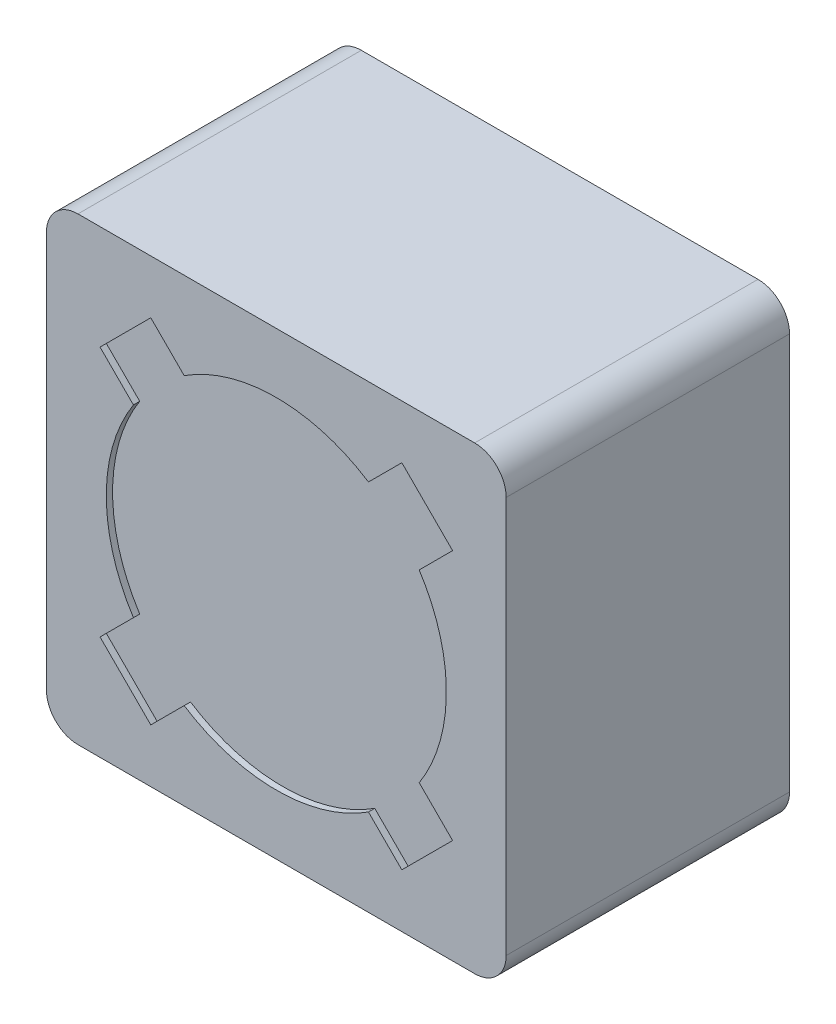
ISO-10303-21;
HEADER;
FILE_DESCRIPTION(('STEP AP214'),'2;1');
FILE_NAME('part.step','',(''),(''),'','','');
FILE_SCHEMA(('AUTOMOTIVE_DESIGN { 1 0 10303 214 1 1 1 1 }'));
ENDSEC;
DATA;
#1=APPLICATION_CONTEXT('core data for automotive mechanical design processes');
#2=APPLICATION_PROTOCOL_DEFINITION('international standard','automotive_design',2000,#1);
#3=PRODUCT_CONTEXT('',#1,'mechanical');
#4=PRODUCT('Part','Part','',(#3));
#5=PRODUCT_RELATED_PRODUCT_CATEGORY('part','',(#4));
#6=PRODUCT_DEFINITION_FORMATION('','',#4);
#7=PRODUCT_DEFINITION_CONTEXT('part definition',#1,'design');
#8=PRODUCT_DEFINITION('design','',#6,#7);
#9=PRODUCT_DEFINITION_SHAPE('','',#8);
#10=(LENGTH_UNIT() NAMED_UNIT(*) SI_UNIT(.MILLI.,.METRE.));
#11=(NAMED_UNIT(*) PLANE_ANGLE_UNIT() SI_UNIT($,.RADIAN.));
#12=(NAMED_UNIT(*) SI_UNIT($,.STERADIAN.) SOLID_ANGLE_UNIT());
#13=UNCERTAINTY_MEASURE_WITH_UNIT(LENGTH_MEASURE(1.E-05),#10,'distance_accuracy_value','');
#14=(GEOMETRIC_REPRESENTATION_CONTEXT(3) GLOBAL_UNCERTAINTY_ASSIGNED_CONTEXT((#13)) GLOBAL_UNIT_ASSIGNED_CONTEXT((#10,
#11,#12)) REPRESENTATION_CONTEXT('',''));
#15=CARTESIAN_POINT('',(0.,0.,0.));
#16=DIRECTION('',(0.,0.,1.));
#17=DIRECTION('',(1.,0.,0.));
#18=AXIS2_PLACEMENT_3D('',#15,#16,#17);
#19=CARTESIAN_POINT('',(0.,0.,4.4));
#20=DIRECTION('',(0.,0.,1.));
#21=DIRECTION('',(1.,0.,0.));
#22=AXIS2_PLACEMENT_3D('',#19,#20,#21);
#23=CYLINDRICAL_SURFACE('',#22,2.7);
#24=CARTESIAN_POINT('',(0.,0.,4.5));
#25=DIRECTION('',(0.,0.,1.));
#26=DIRECTION('',(1.,0.,0.));
#27=AXIS2_PLACEMENT_3D('',#24,#25,#26);
#28=CIRCLE('',#27,2.7);
#29=CARTESIAN_POINT('',(-2.26921002247596,1.46310829192328,4.5));
#30=VERTEX_POINT('',#29);
#31=CARTESIAN_POINT('',(-2.26921002247594,-1.4631082919233,4.5));
#32=VERTEX_POINT('',#31);
#33=EDGE_CURVE('E311',#30,#32,#28,.T.);
#34=ORIENTED_EDGE('',*,*,#33,.T.);
#35=DIRECTION('',(0.,0.,1.));
#36=VECTOR('',#35,1.);
#37=CARTESIAN_POINT('',(-2.26921002247594,-1.4631082919233,4.4));
#38=LINE('',#37,#36);
#39=CARTESIAN_POINT('',(-2.26921002247594,-1.4631082919233,4.4));
#40=VERTEX_POINT('',#39);
#41=EDGE_CURVE('E232',#40,#32,#38,.T.);
#42=ORIENTED_EDGE('',*,*,#41,.F.);
#43=CARTESIAN_POINT('',(0.,0.,4.4));
#44=DIRECTION('',(0.,0.,1.));
#45=DIRECTION('',(1.,0.,0.));
#46=AXIS2_PLACEMENT_3D('',#43,#44,#45);
#47=CIRCLE('',#46,2.7);
#48=CARTESIAN_POINT('',(-2.26921002247596,1.46310829192328,4.4));
#49=VERTEX_POINT('',#48);
#50=EDGE_CURVE('E306',#49,#40,#47,.T.);
#51=ORIENTED_EDGE('',*,*,#50,.F.);
#52=DIRECTION('',(0.,0.,1.));
#53=VECTOR('',#52,1.);
#54=CARTESIAN_POINT('',(-2.26921002247596,1.46310829192328,4.4));
#55=LINE('',#54,#53);
#56=EDGE_CURVE('E302',#49,#30,#55,.T.);
#57=ORIENTED_EDGE('',*,*,#56,.T.);
#58=EDGE_LOOP('',(#34,#42,#51,#57));
#59=FACE_BOUND('',#58,.T.);
#60=ADVANCED_FACE('F35',(#59),#23,.F.);
#61=CARTESIAN_POINT('',(-1.46310829192328,-2.26921002247596,4.4));
#62=VERTEX_POINT('',#61);
#63=CARTESIAN_POINT('',(1.46310829192329,-2.26921002247595,4.4));
#64=VERTEX_POINT('',#63);
#65=EDGE_CURVE('E309',#62,#64,#47,.T.);
#66=ORIENTED_EDGE('',*,*,#65,.F.);
#67=DIRECTION('',(0.,0.,1.));
#68=VECTOR('',#67,1.);
#69=CARTESIAN_POINT('',(-1.46310829192328,-2.26921002247596,4.4));
#70=LINE('',#69,#68);
#71=CARTESIAN_POINT('',(-1.46310829192328,-2.26921002247596,4.5));
#72=VERTEX_POINT('',#71);
#73=EDGE_CURVE('E207',#62,#72,#70,.T.);
#74=ORIENTED_EDGE('',*,*,#73,.T.);
#75=CARTESIAN_POINT('',(1.46310829192329,-2.26921002247595,4.5));
#76=VERTEX_POINT('',#75);
#77=EDGE_CURVE('E314',#72,#76,#28,.T.);
#78=ORIENTED_EDGE('',*,*,#77,.T.);
#79=DIRECTION('',(0.,0.,1.));
#80=VECTOR('',#79,1.);
#81=CARTESIAN_POINT('',(1.46310829192329,-2.26921002247595,4.4));
#82=LINE('',#81,#80);
#83=EDGE_CURVE('E252',#64,#76,#82,.T.);
#84=ORIENTED_EDGE('',*,*,#83,.F.);
#85=EDGE_LOOP('',(#66,#74,#78,#84));
#86=FACE_BOUND('',#85,.T.);
#87=ADVANCED_FACE('F418',(#86),#23,.F.);
#88=CARTESIAN_POINT('',(2.26921002247596,-1.46310829192328,4.4));
#89=VERTEX_POINT('',#88);
#90=CARTESIAN_POINT('',(2.26921002247594,1.46310829192332,4.4));
#91=VERTEX_POINT('',#90);
#92=EDGE_CURVE('E624',#89,#91,#47,.T.);
#93=ORIENTED_EDGE('',*,*,#92,.F.);
#94=DIRECTION('',(0.,0.,1.));
#95=VECTOR('',#94,1.);
#96=CARTESIAN_POINT('',(2.26921002247596,-1.46310829192328,4.4));
#97=LINE('',#96,#95);
#98=CARTESIAN_POINT('',(2.26921002247596,-1.46310829192328,4.5));
#99=VERTEX_POINT('',#98);
#100=EDGE_CURVE('E254',#89,#99,#97,.T.);
#101=ORIENTED_EDGE('',*,*,#100,.T.);
#102=CARTESIAN_POINT('',(2.26921002247594,1.46310829192332,4.5));
#103=VERTEX_POINT('',#102);
#104=EDGE_CURVE('E633',#99,#103,#28,.T.);
#105=ORIENTED_EDGE('',*,*,#104,.T.);
#106=DIRECTION('',(0.,0.,1.));
#107=VECTOR('',#106,1.);
#108=CARTESIAN_POINT('',(2.26921002247594,1.46310829192332,4.4));
#109=LINE('',#108,#107);
#110=EDGE_CURVE('E274',#91,#103,#109,.T.);
#111=ORIENTED_EDGE('',*,*,#110,.F.);
#112=EDGE_LOOP('',(#93,#101,#105,#111));
#113=FACE_BOUND('',#112,.T.);
#114=ADVANCED_FACE('F416',(#113),#23,.F.);
#115=CARTESIAN_POINT('',(3.65,-3.65,4.5));
#116=DIRECTION('',(-1.,0.,0.));
#117=DIRECTION('',(0.,0.,1.));
#118=AXIS2_PLACEMENT_3D('',#115,#116,#117);
#119=PLANE('',#118);
#120=DIRECTION('',(0.,1.,0.));
#121=VECTOR('',#120,1.);
#122=CARTESIAN_POINT('',(3.65,-3.65,4.5));
#123=LINE('',#122,#121);
#124=CARTESIAN_POINT('',(3.65,-3.15,4.5));
#125=VERTEX_POINT('',#124);
#126=CARTESIAN_POINT('',(3.65,3.15,4.5));
#127=VERTEX_POINT('',#126);
#128=EDGE_CURVE('E315',#125,#127,#123,.T.);
#129=ORIENTED_EDGE('',*,*,#128,.F.);
#130=DIRECTION('',(0.,0.,-1.));
#131=VECTOR('',#130,1.);
#132=CARTESIAN_POINT('',(3.65,-3.15,4.5));
#133=LINE('',#132,#131);
#134=CARTESIAN_POINT('',(3.65,-3.15,0.));
#135=VERTEX_POINT('',#134);
#136=EDGE_CURVE('E366',#125,#135,#133,.T.);
#137=ORIENTED_EDGE('',*,*,#136,.T.);
#138=DIRECTION('',(0.,1.,0.));
#139=VECTOR('',#138,1.);
#140=CARTESIAN_POINT('',(3.65,-3.65,0.));
#141=LINE('',#140,#139);
#142=CARTESIAN_POINT('',(3.65,3.15,0.));
#143=VERTEX_POINT('',#142);
#144=EDGE_CURVE('E308',#135,#143,#141,.T.);
#145=ORIENTED_EDGE('',*,*,#144,.T.);
#146=DIRECTION('',(0.,0.,-1.));
#147=VECTOR('',#146,1.);
#148=CARTESIAN_POINT('',(3.65,3.15,4.5));
#149=LINE('',#148,#147);
#150=EDGE_CURVE('E364',#143,#127,#149,.F.);
#151=ORIENTED_EDGE('',*,*,#150,.T.);
#152=EDGE_LOOP('',(#129,#137,#145,#151));
#153=FACE_BOUND('',#152,.T.);
#154=ADVANCED_FACE('F406',(#153),#119,.F.);
#155=CARTESIAN_POINT('',(-3.65,3.65,4.5));
#156=DIRECTION('',(0.,-1.,0.));
#157=DIRECTION('',(0.,0.,-1.));
#158=AXIS2_PLACEMENT_3D('',#155,#156,#157);
#159=PLANE('',#158);
#160=DIRECTION('',(-1.,0.,0.));
#161=VECTOR('',#160,1.);
#162=CARTESIAN_POINT('',(-3.65,3.65,0.));
#163=LINE('',#162,#161);
#164=CARTESIAN_POINT('',(3.15,3.65,0.));
#165=VERTEX_POINT('',#164);
#166=CARTESIAN_POINT('',(-3.15,3.65,0.));
#167=VERTEX_POINT('',#166);
#168=EDGE_CURVE('E331',#165,#167,#163,.T.);
#169=ORIENTED_EDGE('',*,*,#168,.T.);
#170=DIRECTION('',(0.,0.,-1.));
#171=VECTOR('',#170,1.);
#172=CARTESIAN_POINT('',(-3.15,3.65,4.5));
#173=LINE('',#172,#171);
#174=CARTESIAN_POINT('',(-3.15,3.65,4.5));
#175=VERTEX_POINT('',#174);
#176=EDGE_CURVE('E11',#167,#175,#173,.F.);
#177=ORIENTED_EDGE('',*,*,#176,.T.);
#178=DIRECTION('',(-1.,0.,0.));
#179=VECTOR('',#178,1.);
#180=CARTESIAN_POINT('',(-3.65,3.65,4.5));
#181=LINE('',#180,#179);
#182=CARTESIAN_POINT('',(3.15,3.65,4.5));
#183=VERTEX_POINT('',#182);
#184=EDGE_CURVE('E318',#183,#175,#181,.T.);
#185=ORIENTED_EDGE('',*,*,#184,.F.);
#186=DIRECTION('',(0.,0.,-1.));
#187=VECTOR('',#186,1.);
#188=CARTESIAN_POINT('',(3.15,3.65,4.5));
#189=LINE('',#188,#187);
#190=EDGE_CURVE('E43',#183,#165,#189,.T.);
#191=ORIENTED_EDGE('',*,*,#190,.T.);
#192=EDGE_LOOP('',(#169,#177,#185,#191));
#193=FACE_BOUND('',#192,.T.);
#194=ADVANCED_FACE('F373',(#193),#159,.F.);
#195=CARTESIAN_POINT('',(-3.65,-3.65,4.5));
#196=DIRECTION('',(1.,0.,0.));
#197=DIRECTION('',(0.,0.,-1.));
#198=AXIS2_PLACEMENT_3D('',#195,#196,#197);
#199=PLANE('',#198);
#200=DIRECTION('',(0.,-1.,0.));
#201=VECTOR('',#200,1.);
#202=CARTESIAN_POINT('',(-3.65,-3.65,0.));
#203=LINE('',#202,#201);
#204=CARTESIAN_POINT('',(-3.65,3.15,0.));
#205=VERTEX_POINT('',#204);
#206=CARTESIAN_POINT('',(-3.65,-3.15,0.));
#207=VERTEX_POINT('',#206);
#208=EDGE_CURVE('E334',#205,#207,#203,.T.);
#209=ORIENTED_EDGE('',*,*,#208,.T.);
#210=DIRECTION('',(0.,0.,-1.));
#211=VECTOR('',#210,1.);
#212=CARTESIAN_POINT('',(-3.65,-3.15,4.5));
#213=LINE('',#212,#211);
#214=CARTESIAN_POINT('',(-3.65,-3.15,4.5));
#215=VERTEX_POINT('',#214);
#216=EDGE_CURVE('E354',#207,#215,#213,.F.);
#217=ORIENTED_EDGE('',*,*,#216,.T.);
#218=DIRECTION('',(0.,-1.,0.));
#219=VECTOR('',#218,1.);
#220=CARTESIAN_POINT('',(-3.65,-3.65,4.5));
#221=LINE('',#220,#219);
#222=CARTESIAN_POINT('',(-3.65,3.15,4.5));
#223=VERTEX_POINT('',#222);
#224=EDGE_CURVE('E322',#223,#215,#221,.T.);
#225=ORIENTED_EDGE('',*,*,#224,.F.);
#226=DIRECTION('',(0.,0.,-1.));
#227=VECTOR('',#226,1.);
#228=CARTESIAN_POINT('',(-3.65,3.15,4.5));
#229=LINE('',#228,#227);
#230=EDGE_CURVE('E351',#223,#205,#229,.T.);
#231=ORIENTED_EDGE('',*,*,#230,.T.);
#232=EDGE_LOOP('',(#209,#217,#225,#231));
#233=FACE_BOUND('',#232,.T.);
#234=ADVANCED_FACE('F388',(#233),#199,.F.);
#235=CARTESIAN_POINT('',(-3.65,-3.65,4.5));
#236=DIRECTION('',(0.,1.,0.));
#237=DIRECTION('',(0.,0.,1.));
#238=AXIS2_PLACEMENT_3D('',#235,#236,#237);
#239=PLANE('',#238);
#240=DIRECTION('',(1.,0.,0.));
#241=VECTOR('',#240,1.);
#242=CARTESIAN_POINT('',(-3.65,-3.65,4.5));
#243=LINE('',#242,#241);
#244=CARTESIAN_POINT('',(-3.15,-3.65,4.5));
#245=VERTEX_POINT('',#244);
#246=CARTESIAN_POINT('',(3.15,-3.65,4.5));
#247=VERTEX_POINT('',#246);
#248=EDGE_CURVE('E325',#245,#247,#243,.T.);
#249=ORIENTED_EDGE('',*,*,#248,.F.);
#250=DIRECTION('',(0.,0.,-1.));
#251=VECTOR('',#250,1.);
#252=CARTESIAN_POINT('',(-3.15,-3.65,4.5));
#253=LINE('',#252,#251);
#254=CARTESIAN_POINT('',(-3.15,-3.65,0.));
#255=VERTEX_POINT('',#254);
#256=EDGE_CURVE('E340',#245,#255,#253,.T.);
#257=ORIENTED_EDGE('',*,*,#256,.T.);
#258=DIRECTION('',(1.,0.,0.));
#259=VECTOR('',#258,1.);
#260=CARTESIAN_POINT('',(-3.65,-3.65,0.));
#261=LINE('',#260,#259);
#262=CARTESIAN_POINT('',(3.15,-3.65,0.));
#263=VERTEX_POINT('',#262);
#264=EDGE_CURVE('E319',#255,#263,#261,.T.);
#265=ORIENTED_EDGE('',*,*,#264,.T.);
#266=DIRECTION('',(0.,0.,-1.));
#267=VECTOR('',#266,1.);
#268=CARTESIAN_POINT('',(3.15,-3.65,4.5));
#269=LINE('',#268,#267);
#270=EDGE_CURVE('E328',#263,#247,#269,.F.);
#271=ORIENTED_EDGE('',*,*,#270,.T.);
#272=EDGE_LOOP('',(#249,#257,#265,#271));
#273=FACE_BOUND('',#272,.T.);
#274=ADVANCED_FACE('F398',(#273),#239,.F.);
#275=CARTESIAN_POINT('',(0.,0.,4.5));
#276=DIRECTION('',(0.,0.,-1.));
#277=DIRECTION('',(-1.,0.,0.));
#278=AXIS2_PLACEMENT_3D('',#275,#276,#277);
#279=PLANE('',#278);
#280=DIRECTION('',(0.707106781186551,-0.707106781186544,0.));
#281=VECTOR('',#280,1.);
#282=CARTESIAN_POINT('',(-1.99343837781318,-2.79954010836588,4.5));
#283=LINE('',#282,#281);
#284=CARTESIAN_POINT('',(-2.79954010836585,-1.99343837781322,4.5));
#285=VERTEX_POINT('',#284);
#286=CARTESIAN_POINT('',(-1.99343837781318,-2.79954010836588,4.5));
#287=VERTEX_POINT('',#286);
#288=EDGE_CURVE('E204',#285,#287,#283,.T.);
#289=ORIENTED_EDGE('',*,*,#288,.F.);
#290=DIRECTION('',(-0.707106781186543,-0.707106781186552,0.));
#291=VECTOR('',#290,1.);
#292=CARTESIAN_POINT('',(-2.79954010836585,-1.99343837781322,4.5));
#293=LINE('',#292,#291);
#294=EDGE_CURVE('E219',#32,#285,#293,.T.);
#295=ORIENTED_EDGE('',*,*,#294,.F.);
#296=ORIENTED_EDGE('',*,*,#33,.F.);
#297=DIRECTION('',(0.707106781186549,-0.707106781186546,0.));
#298=VECTOR('',#297,1.);
#299=CARTESIAN_POINT('',(-2.79954010836587,1.99343837781319,4.5));
#300=LINE('',#299,#298);
#301=CARTESIAN_POINT('',(-2.79954010836587,1.99343837781319,4.5));
#302=VERTEX_POINT('',#301);
#303=EDGE_CURVE('E292',#302,#30,#300,.T.);
#304=ORIENTED_EDGE('',*,*,#303,.F.);
#305=DIRECTION('',(-0.707106781186546,-0.707106781186549,0.));
#306=VECTOR('',#305,1.);
#307=CARTESIAN_POINT('',(-2.79954010836587,1.99343837781319,4.5));
#308=LINE('',#307,#306);
#309=CARTESIAN_POINT('',(-1.99343837781321,2.79954010836586,4.5));
#310=VERTEX_POINT('',#309);
#311=EDGE_CURVE('E231',#310,#302,#308,.T.);
#312=ORIENTED_EDGE('',*,*,#311,.F.);
#313=DIRECTION('',(-0.707106781186549,0.707106781186546,0.));
#314=VECTOR('',#313,1.);
#315=CARTESIAN_POINT('',(-1.99343837781321,2.79954010836586,4.5));
#316=LINE('',#315,#314);
#317=CARTESIAN_POINT('',(-1.46310829192329,2.26921002247595,4.5));
#318=VERTEX_POINT('',#317);
#319=EDGE_CURVE('E284',#318,#310,#316,.T.);
#320=ORIENTED_EDGE('',*,*,#319,.F.);
#321=CARTESIAN_POINT('',(1.46310829192326,2.26921002247597,4.5));
#322=VERTEX_POINT('',#321);
#323=EDGE_CURVE('E298',#322,#318,#28,.T.);
#324=ORIENTED_EDGE('',*,*,#323,.F.);
#325=DIRECTION('',(-0.707106781186539,-0.707106781186556,0.));
#326=VECTOR('',#325,1.);
#327=CARTESIAN_POINT('',(1.99343837781316,2.79954010836589,4.5));
#328=LINE('',#327,#326);
#329=CARTESIAN_POINT('',(1.99343837781316,2.79954010836589,4.5));
#330=VERTEX_POINT('',#329);
#331=EDGE_CURVE('E269',#330,#322,#328,.T.);
#332=ORIENTED_EDGE('',*,*,#331,.F.);
#333=DIRECTION('',(-0.707106781186556,0.707106781186539,0.));
#334=VECTOR('',#333,1.);
#335=CARTESIAN_POINT('',(1.99343837781316,2.79954010836589,4.5));
#336=LINE('',#335,#334);
#337=CARTESIAN_POINT('',(2.79954010836584,1.99343837781324,4.5));
#338=VERTEX_POINT('',#337);
#339=EDGE_CURVE('E266',#338,#330,#336,.T.);
#340=ORIENTED_EDGE('',*,*,#339,.F.);
#341=DIRECTION('',(0.707106781186538,0.707106781186557,0.));
#342=VECTOR('',#341,1.);
#343=CARTESIAN_POINT('',(2.79954010836584,1.99343837781324,4.5));
#344=LINE('',#343,#342);
#345=EDGE_CURVE('E260',#103,#338,#344,.T.);
#346=ORIENTED_EDGE('',*,*,#345,.F.);
#347=ORIENTED_EDGE('',*,*,#104,.F.);
#348=DIRECTION('',(-0.707106781186549,0.707106781186546,0.));
#349=VECTOR('',#348,1.);
#350=CARTESIAN_POINT('',(2.79954010836587,-1.99343837781319,4.5));
#351=LINE('',#350,#349);
#352=CARTESIAN_POINT('',(2.79954010836587,-1.99343837781319,4.5));
#353=VERTEX_POINT('',#352);
#354=EDGE_CURVE('E246',#353,#99,#351,.T.);
#355=ORIENTED_EDGE('',*,*,#354,.F.);
#356=DIRECTION('',(0.707106781186546,0.707106781186549,0.));
#357=VECTOR('',#356,1.);
#358=CARTESIAN_POINT('',(2.79954010836587,-1.99343837781319,4.5));
#359=LINE('',#358,#357);
#360=CARTESIAN_POINT('',(1.99343837781321,-2.79954010836586,4.5));
#361=VERTEX_POINT('',#360);
#362=EDGE_CURVE('E243',#361,#353,#359,.T.);
#363=ORIENTED_EDGE('',*,*,#362,.F.);
#364=DIRECTION('',(0.707106781186549,-0.707106781186546,0.));
#365=VECTOR('',#364,1.);
#366=CARTESIAN_POINT('',(1.99343837781321,-2.79954010836586,4.5));
#367=LINE('',#366,#365);
#368=EDGE_CURVE('E237',#76,#361,#367,.T.);
#369=ORIENTED_EDGE('',*,*,#368,.F.);
#370=ORIENTED_EDGE('',*,*,#77,.F.);
#371=DIRECTION('',(0.707106781186544,0.707106781186551,0.));
#372=VECTOR('',#371,1.);
#373=CARTESIAN_POINT('',(-1.99343837781318,-2.79954010836588,4.5));
#374=LINE('',#373,#372);
#375=EDGE_CURVE('E222',#287,#72,#374,.T.);
#376=ORIENTED_EDGE('',*,*,#375,.F.);
#377=EDGE_LOOP('',(#289,#295,#296,#304,#312,#320,#324,#332,#340,#346,#347,#355,#363,#369,#370,#376));
#378=FACE_BOUND('',#377,.T.);
#379=ORIENTED_EDGE('',*,*,#224,.T.);
#380=CARTESIAN_POINT('',(-3.15,-3.15,4.5));
#381=DIRECTION('',(0.,0.,-1.));
#382=DIRECTION('',(-1.,0.,0.));
#383=AXIS2_PLACEMENT_3D('',#380,#381,#382);
#384=CIRCLE('',#383,0.5);
#385=EDGE_CURVE('E362',#215,#245,#384,.F.);
#386=ORIENTED_EDGE('',*,*,#385,.T.);
#387=ORIENTED_EDGE('',*,*,#248,.T.);
#388=CARTESIAN_POINT('',(3.15,-3.15,4.5));
#389=DIRECTION('',(0.,0.,-1.));
#390=DIRECTION('',(-1.,0.,0.));
#391=AXIS2_PLACEMENT_3D('',#388,#389,#390);
#392=CIRCLE('',#391,0.5);
#393=EDGE_CURVE('E360',#247,#125,#392,.F.);
#394=ORIENTED_EDGE('',*,*,#393,.T.);
#395=ORIENTED_EDGE('',*,*,#128,.T.);
#396=CARTESIAN_POINT('',(3.15,3.15,4.5));
#397=DIRECTION('',(0.,0.,-1.));
#398=DIRECTION('',(-1.,0.,0.));
#399=AXIS2_PLACEMENT_3D('',#396,#397,#398);
#400=CIRCLE('',#399,0.5);
#401=EDGE_CURVE('E356',#127,#183,#400,.F.);
#402=ORIENTED_EDGE('',*,*,#401,.T.);
#403=ORIENTED_EDGE('',*,*,#184,.T.);
#404=CARTESIAN_POINT('',(-3.15,3.15,4.5));
#405=DIRECTION('',(0.,0.,-1.));
#406=DIRECTION('',(-1.,0.,0.));
#407=AXIS2_PLACEMENT_3D('',#404,#405,#406);
#408=CIRCLE('',#407,0.5);
#409=EDGE_CURVE('E358',#175,#223,#408,.F.);
#410=ORIENTED_EDGE('',*,*,#409,.T.);
#411=EDGE_LOOP('',(#379,#386,#387,#394,#395,#402,#403,#410));
#412=FACE_BOUND('',#411,.T.);
#413=ADVANCED_FACE('F392',(#378,#412),#279,.F.);
#414=CARTESIAN_POINT('',(0.,0.,0.));
#415=DIRECTION('',(0.,0.,-1.));
#416=DIRECTION('',(-1.,0.,0.));
#417=AXIS2_PLACEMENT_3D('',#414,#415,#416);
#418=PLANE('',#417);
#419=ORIENTED_EDGE('',*,*,#264,.F.);
#420=CARTESIAN_POINT('',(-3.15,-3.15,0.));
#421=DIRECTION('',(0.,0.,-1.));
#422=DIRECTION('',(-1.,0.,0.));
#423=AXIS2_PLACEMENT_3D('',#420,#421,#422);
#424=CIRCLE('',#423,0.5);
#425=EDGE_CURVE('E349',#255,#207,#424,.T.);
#426=ORIENTED_EDGE('',*,*,#425,.T.);
#427=ORIENTED_EDGE('',*,*,#208,.F.);
#428=CARTESIAN_POINT('',(-3.15,3.15,0.));
#429=DIRECTION('',(0.,0.,-1.));
#430=DIRECTION('',(-1.,0.,0.));
#431=AXIS2_PLACEMENT_3D('',#428,#429,#430);
#432=CIRCLE('',#431,0.5);
#433=EDGE_CURVE('E345',#205,#167,#432,.T.);
#434=ORIENTED_EDGE('',*,*,#433,.T.);
#435=ORIENTED_EDGE('',*,*,#168,.F.);
#436=CARTESIAN_POINT('',(3.15,3.15,0.));
#437=DIRECTION('',(0.,0.,-1.));
#438=DIRECTION('',(-1.,0.,0.));
#439=AXIS2_PLACEMENT_3D('',#436,#437,#438);
#440=CIRCLE('',#439,0.5);
#441=EDGE_CURVE('E343',#165,#143,#440,.T.);
#442=ORIENTED_EDGE('',*,*,#441,.T.);
#443=ORIENTED_EDGE('',*,*,#144,.F.);
#444=CARTESIAN_POINT('',(3.15,-3.15,0.));
#445=DIRECTION('',(0.,0.,-1.));
#446=DIRECTION('',(-1.,0.,0.));
#447=AXIS2_PLACEMENT_3D('',#444,#445,#446);
#448=CIRCLE('',#447,0.5);
#449=EDGE_CURVE('E347',#135,#263,#448,.T.);
#450=ORIENTED_EDGE('',*,*,#449,.T.);
#451=EDGE_LOOP('',(#419,#426,#427,#434,#435,#442,#443,#450));
#452=FACE_BOUND('',#451,.T.);
#453=ADVANCED_FACE('F379',(#452),#418,.T.);
#454=CARTESIAN_POINT('',(-3.15,-3.15,4.5));
#455=DIRECTION('',(0.,0.,-1.));
#456=DIRECTION('',(-1.,0.,0.));
#457=AXIS2_PLACEMENT_3D('',#454,#455,#456);
#458=CYLINDRICAL_SURFACE('',#457,0.5);
#459=ORIENTED_EDGE('',*,*,#385,.F.);
#460=ORIENTED_EDGE('',*,*,#216,.F.);
#461=ORIENTED_EDGE('',*,*,#425,.F.);
#462=ORIENTED_EDGE('',*,*,#256,.F.);
#463=EDGE_LOOP('',(#459,#460,#461,#462));
#464=FACE_BOUND('',#463,.T.);
#465=ADVANCED_FACE('F396',(#464),#458,.T.);
#466=CARTESIAN_POINT('',(3.15,-3.15,4.5));
#467=DIRECTION('',(0.,0.,-1.));
#468=DIRECTION('',(-1.,0.,0.));
#469=AXIS2_PLACEMENT_3D('',#466,#467,#468);
#470=CYLINDRICAL_SURFACE('',#469,0.5);
#471=ORIENTED_EDGE('',*,*,#393,.F.);
#472=ORIENTED_EDGE('',*,*,#270,.F.);
#473=ORIENTED_EDGE('',*,*,#449,.F.);
#474=ORIENTED_EDGE('',*,*,#136,.F.);
#475=EDGE_LOOP('',(#471,#472,#473,#474));
#476=FACE_BOUND('',#475,.T.);
#477=ADVANCED_FACE('F403',(#476),#470,.T.);
#478=CARTESIAN_POINT('',(-3.15,3.15,4.5));
#479=DIRECTION('',(0.,0.,-1.));
#480=DIRECTION('',(-1.,0.,0.));
#481=AXIS2_PLACEMENT_3D('',#478,#479,#480);
#482=CYLINDRICAL_SURFACE('',#481,0.5);
#483=ORIENTED_EDGE('',*,*,#409,.F.);
#484=ORIENTED_EDGE('',*,*,#176,.F.);
#485=ORIENTED_EDGE('',*,*,#433,.F.);
#486=ORIENTED_EDGE('',*,*,#230,.F.);
#487=EDGE_LOOP('',(#483,#484,#485,#486));
#488=FACE_BOUND('',#487,.T.);
#489=ADVANCED_FACE('F385',(#488),#482,.T.);
#490=CARTESIAN_POINT('',(3.15,3.15,4.5));
#491=DIRECTION('',(0.,0.,-1.));
#492=DIRECTION('',(-1.,0.,0.));
#493=AXIS2_PLACEMENT_3D('',#490,#491,#492);
#494=CYLINDRICAL_SURFACE('',#493,0.5);
#495=ORIENTED_EDGE('',*,*,#401,.F.);
#496=ORIENTED_EDGE('',*,*,#150,.F.);
#497=ORIENTED_EDGE('',*,*,#441,.F.);
#498=ORIENTED_EDGE('',*,*,#190,.F.);
#499=EDGE_LOOP('',(#495,#496,#497,#498));
#500=FACE_BOUND('',#499,.T.);
#501=ADVANCED_FACE('F37',(#500),#494,.T.);
#502=CARTESIAN_POINT('',(1.46310829192326,2.26921002247597,4.4));
#503=VERTEX_POINT('',#502);
#504=CARTESIAN_POINT('',(-1.46310829192329,2.26921002247595,4.4));
#505=VERTEX_POINT('',#504);
#506=EDGE_CURVE('E310',#503,#505,#47,.T.);
#507=ORIENTED_EDGE('',*,*,#506,.F.);
#508=DIRECTION('',(0.,0.,1.));
#509=VECTOR('',#508,1.);
#510=CARTESIAN_POINT('',(1.46310829192326,2.26921002247597,4.4));
#511=LINE('',#510,#509);
#512=EDGE_CURVE('E276',#503,#322,#511,.T.);
#513=ORIENTED_EDGE('',*,*,#512,.T.);
#514=ORIENTED_EDGE('',*,*,#323,.T.);
#515=DIRECTION('',(0.,0.,1.));
#516=VECTOR('',#515,1.);
#517=CARTESIAN_POINT('',(-1.46310829192329,2.26921002247595,4.4));
#518=LINE('',#517,#516);
#519=EDGE_CURVE('E299',#505,#318,#518,.T.);
#520=ORIENTED_EDGE('',*,*,#519,.F.);
#521=EDGE_LOOP('',(#507,#513,#514,#520));
#522=FACE_BOUND('',#521,.T.);
#523=ADVANCED_FACE('F409',(#522),#23,.F.);
#524=CARTESIAN_POINT('',(0.,0.,4.4));
#525=DIRECTION('',(0.,0.,1.));
#526=DIRECTION('',(1.,0.,0.));
#527=AXIS2_PLACEMENT_3D('',#524,#525,#526);
#528=PLANE('',#527);
#529=ORIENTED_EDGE('',*,*,#50,.T.);
#530=DIRECTION('',(-0.707106781186543,-0.707106781186552,0.));
#531=VECTOR('',#530,1.);
#532=CARTESIAN_POINT('',(-2.79954010836585,-1.99343837781322,4.4));
#533=LINE('',#532,#531);
#534=CARTESIAN_POINT('',(-2.79954010836585,-1.99343837781322,4.4));
#535=VERTEX_POINT('',#534);
#536=EDGE_CURVE('E208',#40,#535,#533,.T.);
#537=ORIENTED_EDGE('',*,*,#536,.T.);
#538=DIRECTION('',(0.707106781186551,-0.707106781186544,0.));
#539=VECTOR('',#538,1.);
#540=CARTESIAN_POINT('',(-1.99343837781318,-2.79954010836588,4.4));
#541=LINE('',#540,#539);
#542=CARTESIAN_POINT('',(-1.99343837781318,-2.79954010836588,4.4));
#543=VERTEX_POINT('',#542);
#544=EDGE_CURVE('E201',#535,#543,#541,.T.);
#545=ORIENTED_EDGE('',*,*,#544,.T.);
#546=DIRECTION('',(0.707106781186544,0.707106781186551,0.));
#547=VECTOR('',#546,1.);
#548=CARTESIAN_POINT('',(-1.99343837781318,-2.79954010836588,4.4));
#549=LINE('',#548,#547);
#550=EDGE_CURVE('E211',#543,#62,#549,.T.);
#551=ORIENTED_EDGE('',*,*,#550,.T.);
#552=ORIENTED_EDGE('',*,*,#65,.T.);
#553=DIRECTION('',(0.707106781186549,-0.707106781186546,0.));
#554=VECTOR('',#553,1.);
#555=CARTESIAN_POINT('',(1.99343837781321,-2.79954010836586,4.4));
#556=LINE('',#555,#554);
#557=CARTESIAN_POINT('',(1.99343837781321,-2.79954010836586,4.4));
#558=VERTEX_POINT('',#557);
#559=EDGE_CURVE('E239',#64,#558,#556,.T.);
#560=ORIENTED_EDGE('',*,*,#559,.T.);
#561=DIRECTION('',(0.707106781186546,0.707106781186549,0.));
#562=VECTOR('',#561,1.);
#563=CARTESIAN_POINT('',(2.79954010836587,-1.99343837781319,4.4));
#564=LINE('',#563,#562);
#565=CARTESIAN_POINT('',(2.79954010836587,-1.99343837781319,4.4));
#566=VERTEX_POINT('',#565);
#567=EDGE_CURVE('E235',#558,#566,#564,.T.);
#568=ORIENTED_EDGE('',*,*,#567,.T.);
#569=DIRECTION('',(-0.707106781186549,0.707106781186546,0.));
#570=VECTOR('',#569,1.);
#571=CARTESIAN_POINT('',(2.79954010836587,-1.99343837781319,4.4));
#572=LINE('',#571,#570);
#573=EDGE_CURVE('E57',#566,#89,#572,.T.);
#574=ORIENTED_EDGE('',*,*,#573,.T.);
#575=ORIENTED_EDGE('',*,*,#92,.T.);
#576=DIRECTION('',(0.707106781186538,0.707106781186557,0.));
#577=VECTOR('',#576,1.);
#578=CARTESIAN_POINT('',(2.79954010836584,1.99343837781324,4.4));
#579=LINE('',#578,#577);
#580=CARTESIAN_POINT('',(2.79954010836584,1.99343837781324,4.4));
#581=VERTEX_POINT('',#580);
#582=EDGE_CURVE('E262',#91,#581,#579,.T.);
#583=ORIENTED_EDGE('',*,*,#582,.T.);
#584=DIRECTION('',(-0.707106781186556,0.707106781186539,0.));
#585=VECTOR('',#584,1.);
#586=CARTESIAN_POINT('',(1.99343837781316,2.79954010836589,4.4));
#587=LINE('',#586,#585);
#588=CARTESIAN_POINT('',(1.99343837781316,2.79954010836589,4.4));
#589=VERTEX_POINT('',#588);
#590=EDGE_CURVE('E258',#581,#589,#587,.T.);
#591=ORIENTED_EDGE('',*,*,#590,.T.);
#592=DIRECTION('',(-0.707106781186539,-0.707106781186556,0.));
#593=VECTOR('',#592,1.);
#594=CARTESIAN_POINT('',(1.99343837781316,2.79954010836589,4.4));
#595=LINE('',#594,#593);
#596=EDGE_CURVE('E50',#589,#503,#595,.T.);
#597=ORIENTED_EDGE('',*,*,#596,.T.);
#598=ORIENTED_EDGE('',*,*,#506,.T.);
#599=DIRECTION('',(-0.707106781186549,0.707106781186546,0.));
#600=VECTOR('',#599,1.);
#601=CARTESIAN_POINT('',(-1.99343837781321,2.79954010836586,4.4));
#602=LINE('',#601,#600);
#603=CARTESIAN_POINT('',(-1.99343837781321,2.79954010836586,4.4));
#604=VERTEX_POINT('',#603);
#605=EDGE_CURVE('E286',#505,#604,#602,.T.);
#606=ORIENTED_EDGE('',*,*,#605,.T.);
#607=DIRECTION('',(-0.707106781186546,-0.707106781186549,0.));
#608=VECTOR('',#607,1.);
#609=CARTESIAN_POINT('',(-2.79954010836587,1.99343837781319,4.4));
#610=LINE('',#609,#608);
#611=CARTESIAN_POINT('',(-2.79954010836587,1.99343837781319,4.4));
#612=VERTEX_POINT('',#611);
#613=EDGE_CURVE('E280',#604,#612,#610,.T.);
#614=ORIENTED_EDGE('',*,*,#613,.T.);
#615=DIRECTION('',(0.707106781186549,-0.707106781186546,0.));
#616=VECTOR('',#615,1.);
#617=CARTESIAN_POINT('',(-2.79954010836587,1.99343837781319,4.4));
#618=LINE('',#617,#616);
#619=EDGE_CURVE('E283',#612,#49,#618,.T.);
#620=ORIENTED_EDGE('',*,*,#619,.T.);
#621=EDGE_LOOP('',(#529,#537,#545,#551,#552,#560,#568,#574,#575,#583,#591,#597,#598,#606,#614,#620));
#622=FACE_BOUND('',#621,.T.);
#623=ADVANCED_FACE('F218',(#622),#528,.T.);
#624=CARTESIAN_POINT('',(-2.79954010836587,1.99343837781319,4.4));
#625=DIRECTION('',(-0.707106781186549,0.707106781186546,0.));
#626=DIRECTION('',(-0.707106781186546,-0.707106781186549,0.));
#627=AXIS2_PLACEMENT_3D('',#624,#625,#626);
#628=PLANE('',#627);
#629=ORIENTED_EDGE('',*,*,#311,.T.);
#630=DIRECTION('',(0.,0.,1.));
#631=VECTOR('',#630,1.);
#632=CARTESIAN_POINT('',(-2.79954010836587,1.99343837781319,4.4));
#633=LINE('',#632,#631);
#634=EDGE_CURVE('E289',#612,#302,#633,.T.);
#635=ORIENTED_EDGE('',*,*,#634,.F.);
#636=ORIENTED_EDGE('',*,*,#613,.F.);
#637=DIRECTION('',(0.,0.,1.));
#638=VECTOR('',#637,1.);
#639=CARTESIAN_POINT('',(-1.99343837781321,2.79954010836586,4.4));
#640=LINE('',#639,#638);
#641=EDGE_CURVE('E296',#604,#310,#640,.T.);
#642=ORIENTED_EDGE('',*,*,#641,.T.);
#643=EDGE_LOOP('',(#629,#635,#636,#642));
#644=FACE_BOUND('',#643,.T.);
#645=ADVANCED_FACE('F461',(#644),#628,.F.);
#646=CARTESIAN_POINT('',(-1.99343837781321,2.79954010836586,4.4));
#647=DIRECTION('',(0.707106781186546,0.707106781186549,0.));
#648=DIRECTION('',(-0.707106781186549,0.707106781186546,0.));
#649=AXIS2_PLACEMENT_3D('',#646,#647,#648);
#650=PLANE('',#649);
#651=ORIENTED_EDGE('',*,*,#319,.T.);
#652=ORIENTED_EDGE('',*,*,#641,.F.);
#653=ORIENTED_EDGE('',*,*,#605,.F.);
#654=ORIENTED_EDGE('',*,*,#519,.T.);
#655=EDGE_LOOP('',(#651,#652,#653,#654));
#656=FACE_BOUND('',#655,.T.);
#657=ADVANCED_FACE('F466',(#656),#650,.F.);
#658=CARTESIAN_POINT('',(-2.79954010836587,1.99343837781319,4.4));
#659=DIRECTION('',(-0.707106781186546,-0.707106781186549,0.));
#660=DIRECTION('',(0.707106781186549,-0.707106781186546,0.));
#661=AXIS2_PLACEMENT_3D('',#658,#659,#660);
#662=PLANE('',#661);
#663=ORIENTED_EDGE('',*,*,#303,.T.);
#664=ORIENTED_EDGE('',*,*,#56,.F.);
#665=ORIENTED_EDGE('',*,*,#619,.F.);
#666=ORIENTED_EDGE('',*,*,#634,.T.);
#667=EDGE_LOOP('',(#663,#664,#665,#666));
#668=FACE_BOUND('',#667,.T.);
#669=ADVANCED_FACE('F477',(#668),#662,.F.);
#670=CARTESIAN_POINT('',(1.99343837781316,2.79954010836589,4.4));
#671=DIRECTION('',(0.707106781186539,0.707106781186556,0.));
#672=DIRECTION('',(-0.707106781186556,0.707106781186539,0.));
#673=AXIS2_PLACEMENT_3D('',#670,#671,#672);
#674=PLANE('',#673);
#675=ORIENTED_EDGE('',*,*,#339,.T.);
#676=DIRECTION('',(0.,0.,1.));
#677=VECTOR('',#676,1.);
#678=CARTESIAN_POINT('',(1.99343837781316,2.79954010836589,4.4));
#679=LINE('',#678,#677);
#680=EDGE_CURVE('E265',#589,#330,#679,.T.);
#681=ORIENTED_EDGE('',*,*,#680,.F.);
#682=ORIENTED_EDGE('',*,*,#590,.F.);
#683=DIRECTION('',(0.,0.,1.));
#684=VECTOR('',#683,1.);
#685=CARTESIAN_POINT('',(2.79954010836584,1.99343837781324,4.4));
#686=LINE('',#685,#684);
#687=EDGE_CURVE('E247',#581,#338,#686,.T.);
#688=ORIENTED_EDGE('',*,*,#687,.T.);
#689=EDGE_LOOP('',(#675,#681,#682,#688));
#690=FACE_BOUND('',#689,.T.);
#691=ADVANCED_FACE('F486',(#690),#674,.F.);
#692=CARTESIAN_POINT('',(2.79954010836584,1.99343837781324,4.4));
#693=DIRECTION('',(0.707106781186557,-0.707106781186538,0.));
#694=DIRECTION('',(0.707106781186538,0.707106781186557,0.));
#695=AXIS2_PLACEMENT_3D('',#692,#693,#694);
#696=PLANE('',#695);
#697=ORIENTED_EDGE('',*,*,#345,.T.);
#698=ORIENTED_EDGE('',*,*,#687,.F.);
#699=ORIENTED_EDGE('',*,*,#582,.F.);
#700=ORIENTED_EDGE('',*,*,#110,.T.);
#701=EDGE_LOOP('',(#697,#698,#699,#700));
#702=FACE_BOUND('',#701,.T.);
#703=ADVANCED_FACE('F537',(#702),#696,.F.);
#704=CARTESIAN_POINT('',(1.99343837781316,2.79954010836589,4.4));
#705=DIRECTION('',(-0.707106781186556,0.707106781186539,0.));
#706=DIRECTION('',(-0.707106781186539,-0.707106781186556,0.));
#707=AXIS2_PLACEMENT_3D('',#704,#705,#706);
#708=PLANE('',#707);
#709=ORIENTED_EDGE('',*,*,#331,.T.);
#710=ORIENTED_EDGE('',*,*,#512,.F.);
#711=ORIENTED_EDGE('',*,*,#596,.F.);
#712=ORIENTED_EDGE('',*,*,#680,.T.);
#713=EDGE_LOOP('',(#709,#710,#711,#712));
#714=FACE_BOUND('',#713,.T.);
#715=ADVANCED_FACE('F547',(#714),#708,.F.);
#716=CARTESIAN_POINT('',(2.79954010836587,-1.99343837781319,4.4));
#717=DIRECTION('',(0.707106781186549,-0.707106781186546,0.));
#718=DIRECTION('',(0.707106781186546,0.707106781186549,0.));
#719=AXIS2_PLACEMENT_3D('',#716,#717,#718);
#720=PLANE('',#719);
#721=ORIENTED_EDGE('',*,*,#362,.T.);
#722=DIRECTION('',(0.,0.,1.));
#723=VECTOR('',#722,1.);
#724=CARTESIAN_POINT('',(2.79954010836587,-1.99343837781319,4.4));
#725=LINE('',#724,#723);
#726=EDGE_CURVE('E242',#566,#353,#725,.T.);
#727=ORIENTED_EDGE('',*,*,#726,.F.);
#728=ORIENTED_EDGE('',*,*,#567,.F.);
#729=DIRECTION('',(0.,0.,1.));
#730=VECTOR('',#729,1.);
#731=CARTESIAN_POINT('',(1.99343837781321,-2.79954010836586,4.4));
#732=LINE('',#731,#730);
#733=EDGE_CURVE('E227',#558,#361,#732,.T.);
#734=ORIENTED_EDGE('',*,*,#733,.T.);
#735=EDGE_LOOP('',(#721,#727,#728,#734));
#736=FACE_BOUND('',#735,.T.);
#737=ADVANCED_FACE('F557',(#736),#720,.F.);
#738=CARTESIAN_POINT('',(1.99343837781321,-2.79954010836586,4.4));
#739=DIRECTION('',(-0.707106781186546,-0.707106781186549,0.));
#740=DIRECTION('',(0.707106781186549,-0.707106781186546,0.));
#741=AXIS2_PLACEMENT_3D('',#738,#739,#740);
#742=PLANE('',#741);
#743=ORIENTED_EDGE('',*,*,#368,.T.);
#744=ORIENTED_EDGE('',*,*,#733,.F.);
#745=ORIENTED_EDGE('',*,*,#559,.F.);
#746=ORIENTED_EDGE('',*,*,#83,.T.);
#747=EDGE_LOOP('',(#743,#744,#745,#746));
#748=FACE_BOUND('',#747,.T.);
#749=ADVANCED_FACE('F567',(#748),#742,.F.);
#750=CARTESIAN_POINT('',(2.79954010836587,-1.99343837781319,4.4));
#751=DIRECTION('',(0.707106781186546,0.707106781186549,0.));
#752=DIRECTION('',(-0.707106781186549,0.707106781186546,0.));
#753=AXIS2_PLACEMENT_3D('',#750,#751,#752);
#754=PLANE('',#753);
#755=ORIENTED_EDGE('',*,*,#354,.T.);
#756=ORIENTED_EDGE('',*,*,#100,.F.);
#757=ORIENTED_EDGE('',*,*,#573,.F.);
#758=ORIENTED_EDGE('',*,*,#726,.T.);
#759=EDGE_LOOP('',(#755,#756,#757,#758));
#760=FACE_BOUND('',#759,.T.);
#761=ADVANCED_FACE('F577',(#760),#754,.F.);
#762=CARTESIAN_POINT('',(-1.99343837781318,-2.79954010836588,4.4));
#763=DIRECTION('',(-0.707106781186544,-0.707106781186551,0.));
#764=DIRECTION('',(0.707106781186551,-0.707106781186544,0.));
#765=AXIS2_PLACEMENT_3D('',#762,#763,#764);
#766=PLANE('',#765);
#767=ORIENTED_EDGE('',*,*,#288,.T.);
#768=DIRECTION('',(0.,0.,1.));
#769=VECTOR('',#768,1.);
#770=CARTESIAN_POINT('',(-1.99343837781318,-2.79954010836588,4.4));
#771=LINE('',#770,#769);
#772=EDGE_CURVE('E197',#543,#287,#771,.T.);
#773=ORIENTED_EDGE('',*,*,#772,.F.);
#774=ORIENTED_EDGE('',*,*,#544,.F.);
#775=DIRECTION('',(0.,0.,1.));
#776=VECTOR('',#775,1.);
#777=CARTESIAN_POINT('',(-2.79954010836585,-1.99343837781322,4.4));
#778=LINE('',#777,#776);
#779=EDGE_CURVE('E229',#535,#285,#778,.T.);
#780=ORIENTED_EDGE('',*,*,#779,.T.);
#781=EDGE_LOOP('',(#767,#773,#774,#780));
#782=FACE_BOUND('',#781,.T.);
#783=ADVANCED_FACE('F199',(#782),#766,.F.);
#784=CARTESIAN_POINT('',(-2.79954010836585,-1.99343837781322,4.4));
#785=DIRECTION('',(-0.707106781186552,0.707106781186543,0.));
#786=DIRECTION('',(-0.707106781186543,-0.707106781186552,0.));
#787=AXIS2_PLACEMENT_3D('',#784,#785,#786);
#788=PLANE('',#787);
#789=ORIENTED_EDGE('',*,*,#294,.T.);
#790=ORIENTED_EDGE('',*,*,#779,.F.);
#791=ORIENTED_EDGE('',*,*,#536,.F.);
#792=ORIENTED_EDGE('',*,*,#41,.T.);
#793=EDGE_LOOP('',(#789,#790,#791,#792));
#794=FACE_BOUND('',#793,.T.);
#795=ADVANCED_FACE('F596',(#794),#788,.F.);
#796=CARTESIAN_POINT('',(-1.99343837781318,-2.79954010836588,4.4));
#797=DIRECTION('',(0.707106781186551,-0.707106781186544,0.));
#798=DIRECTION('',(0.707106781186544,0.707106781186551,0.));
#799=AXIS2_PLACEMENT_3D('',#796,#797,#798);
#800=PLANE('',#799);
#801=ORIENTED_EDGE('',*,*,#375,.T.);
#802=ORIENTED_EDGE('',*,*,#73,.F.);
#803=ORIENTED_EDGE('',*,*,#550,.F.);
#804=ORIENTED_EDGE('',*,*,#772,.T.);
#805=EDGE_LOOP('',(#801,#802,#803,#804));
#806=FACE_BOUND('',#805,.T.);
#807=ADVANCED_FACE('F212',(#806),#800,.F.);
#808=CLOSED_SHELL('',(#60,#87,#114,#154,#194,#234,#274,#413,#453,#465,#477,#489,#501,#523,#623,
#645,#657,#669,#691,#703,#715,#737,#749,#761,#783,#795,#807));
#809=MANIFOLD_SOLID_BREP('B2',#808);
#810=ADVANCED_BREP_SHAPE_REPRESENTATION('',(#18,#809),#14);
#811=SHAPE_DEFINITION_REPRESENTATION(#9,#810);
ENDSEC;
END-ISO-10303-21;
